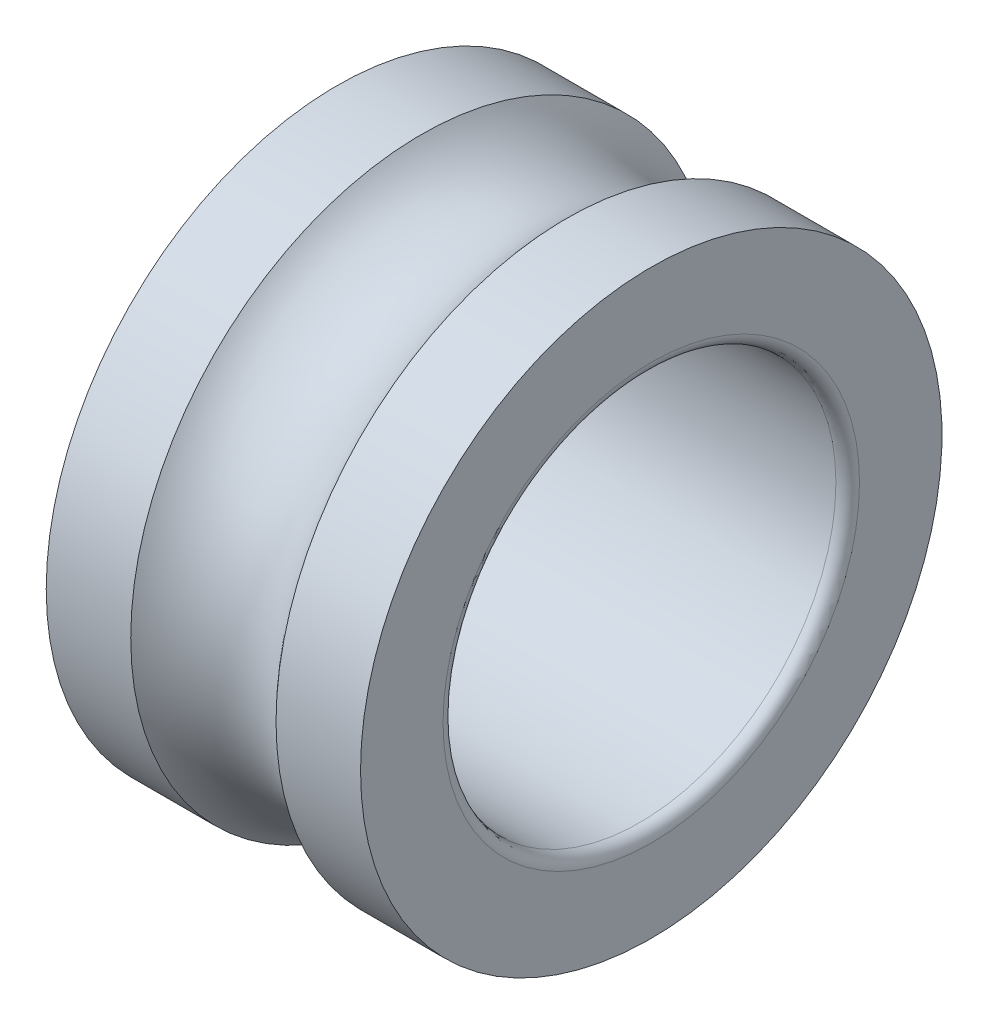
ISO-10303-21;
HEADER;
FILE_DESCRIPTION(('STEP AP214'),'2;1');
FILE_NAME('part.step','',(''),(''),'','','');
FILE_SCHEMA(('AUTOMOTIVE_DESIGN { 1 0 10303 214 1 1 1 1 }'));
ENDSEC;
DATA;
#1=APPLICATION_CONTEXT('core data for automotive mechanical design processes');
#2=APPLICATION_PROTOCOL_DEFINITION('international standard','automotive_design',2000,#1);
#3=PRODUCT_CONTEXT('',#1,'mechanical');
#4=PRODUCT('Part','Part','',(#3));
#5=PRODUCT_RELATED_PRODUCT_CATEGORY('part','',(#4));
#6=PRODUCT_DEFINITION_FORMATION('','',#4);
#7=PRODUCT_DEFINITION_CONTEXT('part definition',#1,'design');
#8=PRODUCT_DEFINITION('design','',#6,#7);
#9=PRODUCT_DEFINITION_SHAPE('','',#8);
#10=(LENGTH_UNIT() NAMED_UNIT(*) SI_UNIT(.MILLI.,.METRE.));
#11=(NAMED_UNIT(*) PLANE_ANGLE_UNIT() SI_UNIT($,.RADIAN.));
#12=(NAMED_UNIT(*) SI_UNIT($,.STERADIAN.) SOLID_ANGLE_UNIT());
#13=UNCERTAINTY_MEASURE_WITH_UNIT(LENGTH_MEASURE(1.E-05),#10,'distance_accuracy_value','');
#14=(GEOMETRIC_REPRESENTATION_CONTEXT(3) GLOBAL_UNCERTAINTY_ASSIGNED_CONTEXT((#13)) GLOBAL_UNIT_ASSIGNED_CONTEXT((#10,
#11,#12)) REPRESENTATION_CONTEXT('',''));
#15=CARTESIAN_POINT('',(0.,0.,0.));
#16=DIRECTION('',(0.,0.,1.));
#17=DIRECTION('',(1.,0.,0.));
#18=AXIS2_PLACEMENT_3D('',#15,#16,#17);
#19=CARTESIAN_POINT('',(4.,0.,0.));
#20=DIRECTION('',(1.,0.,0.));
#21=DIRECTION('',(0.,0.,-1.));
#22=AXIS2_PLACEMENT_3D('',#19,#20,#21);
#23=TOROIDAL_SURFACE('',#22,8.9,2.381);
#24=CARTESIAN_POINT('',(2.15090265264373,0.,0.));
#25=DIRECTION('',(-1.,0.,0.));
#26=DIRECTION('',(0.,0.,1.));
#27=AXIS2_PLACEMENT_3D('',#24,#25,#26);
#28=CIRCLE('',#27,7.4);
#29=CARTESIAN_POINT('',(2.15090265264373,0.,7.4));
#30=VERTEX_POINT('',#29);
#31=EDGE_CURVE('E109',#30,#30,#28,.T.);
#32=ORIENTED_EDGE('',*,*,#31,.F.);
#33=EDGE_LOOP('',(#32));
#34=FACE_BOUND('',#33,.T.);
#35=CARTESIAN_POINT('',(5.84909734735627,0.,0.));
#36=DIRECTION('',(-1.,0.,0.));
#37=DIRECTION('',(0.,0.,1.));
#38=AXIS2_PLACEMENT_3D('',#35,#36,#37);
#39=CIRCLE('',#38,7.4);
#40=CARTESIAN_POINT('',(5.84909734735627,0.,7.4));
#41=VERTEX_POINT('',#40);
#42=EDGE_CURVE('E114',#41,#41,#39,.F.);
#43=ORIENTED_EDGE('',*,*,#42,.F.);
#44=EDGE_LOOP('',(#43));
#45=FACE_BOUND('',#44,.T.);
#46=ADVANCED_FACE('F14',(#34,#45),#23,.F.);
#47=CARTESIAN_POINT('',(50.,0.,0.));
#48=DIRECTION('',(-1.,0.,0.));
#49=DIRECTION('',(0.,0.,1.));
#50=AXIS2_PLACEMENT_3D('',#47,#48,#49);
#51=CYLINDRICAL_SURFACE('',#50,7.4);
#52=CARTESIAN_POINT('',(8.,0.,0.));
#53=DIRECTION('',(-1.,0.,0.));
#54=DIRECTION('',(0.,0.,1.));
#55=AXIS2_PLACEMENT_3D('',#52,#53,#54);
#56=CIRCLE('',#55,7.4);
#57=CARTESIAN_POINT('',(8.,0.,7.4));
#58=VERTEX_POINT('',#57);
#59=EDGE_CURVE('E18',#58,#58,#56,.F.);
#60=ORIENTED_EDGE('',*,*,#59,.F.);
#61=EDGE_LOOP('',(#60));
#62=FACE_BOUND('',#61,.T.);
#63=ORIENTED_EDGE('',*,*,#42,.T.);
#64=EDGE_LOOP('',(#63));
#65=FACE_BOUND('',#64,.T.);
#66=ADVANCED_FACE('F84',(#62,#65),#51,.T.);
#67=CARTESIAN_POINT('',(50.,0.,0.));
#68=DIRECTION('',(-1.,0.,0.));
#69=DIRECTION('',(0.,0.,1.));
#70=AXIS2_PLACEMENT_3D('',#67,#68,#69);
#71=CYLINDRICAL_SURFACE('',#70,7.4);
#72=ORIENTED_EDGE('',*,*,#31,.T.);
#73=EDGE_LOOP('',(#72));
#74=FACE_BOUND('',#73,.T.);
#75=CARTESIAN_POINT('',(0.,0.,0.));
#76=DIRECTION('',(-1.,0.,0.));
#77=DIRECTION('',(0.,0.,1.));
#78=AXIS2_PLACEMENT_3D('',#75,#76,#77);
#79=CIRCLE('',#78,7.4);
#80=CARTESIAN_POINT('',(0.,0.,7.4));
#81=VERTEX_POINT('',#80);
#82=EDGE_CURVE('E104',#81,#81,#79,.T.);
#83=ORIENTED_EDGE('',*,*,#82,.F.);
#84=EDGE_LOOP('',(#83));
#85=FACE_BOUND('',#84,.T.);
#86=ADVANCED_FACE('F81',(#74,#85),#71,.T.);
#87=CARTESIAN_POINT('',(8.,5.3,0.));
#88=DIRECTION('',(1.,0.,0.));
#89=DIRECTION('',(0.,0.,-1.));
#90=AXIS2_PLACEMENT_3D('',#87,#88,#89);
#91=PLANE('',#90);
#92=CARTESIAN_POINT('',(8.,0.,0.));
#93=DIRECTION('',(1.,0.,0.));
#94=DIRECTION('',(0.,0.,-1.));
#95=AXIS2_PLACEMENT_3D('',#92,#93,#94);
#96=CIRCLE('',#95,5.3);
#97=CARTESIAN_POINT('',(8.,0.,-5.3));
#98=VERTEX_POINT('',#97);
#99=EDGE_CURVE('E65',#98,#98,#96,.T.);
#100=ORIENTED_EDGE('',*,*,#99,.F.);
#101=EDGE_LOOP('',(#100));
#102=FACE_BOUND('',#101,.T.);
#103=ORIENTED_EDGE('',*,*,#59,.T.);
#104=EDGE_LOOP('',(#103));
#105=FACE_BOUND('',#104,.T.);
#106=ADVANCED_FACE('F71',(#102,#105),#91,.T.);
#107=CARTESIAN_POINT('',(0.,7.4,0.));
#108=DIRECTION('',(-1.,0.,0.));
#109=DIRECTION('',(0.,0.,1.));
#110=AXIS2_PLACEMENT_3D('',#107,#108,#109);
#111=PLANE('',#110);
#112=ORIENTED_EDGE('',*,*,#82,.T.);
#113=EDGE_LOOP('',(#112));
#114=FACE_BOUND('',#113,.T.);
#115=CARTESIAN_POINT('',(0.,0.,0.));
#116=DIRECTION('',(-1.,0.,0.));
#117=DIRECTION('',(0.,0.,-1.));
#118=AXIS2_PLACEMENT_3D('',#115,#116,#117);
#119=CIRCLE('',#118,5.30000000447035);
#120=CARTESIAN_POINT('',(0.,0.,-5.30000000447035));
#121=VERTEX_POINT('',#120);
#122=EDGE_CURVE('E27',#121,#121,#119,.T.);
#123=ORIENTED_EDGE('',*,*,#122,.F.);
#124=EDGE_LOOP('',(#123));
#125=FACE_BOUND('',#124,.T.);
#126=ADVANCED_FACE('F80',(#114,#125),#111,.T.);
#127=CARTESIAN_POINT('',(7.7,0.,0.));
#128=DIRECTION('',(1.,0.,0.));
#129=DIRECTION('',(0.,0.,-1.));
#130=AXIS2_PLACEMENT_3D('',#127,#128,#129);
#131=TOROIDAL_SURFACE('',#130,5.3,0.300000000000003);
#132=CARTESIAN_POINT('',(7.7,0.,0.));
#133=DIRECTION('',(-1.,0.,0.));
#134=DIRECTION('',(0.,0.,1.));
#135=AXIS2_PLACEMENT_3D('',#132,#133,#134);
#136=CIRCLE('',#135,5.);
#137=CARTESIAN_POINT('',(7.7,0.,5.));
#138=VERTEX_POINT('',#137);
#139=EDGE_CURVE('E22',#138,#138,#136,.T.);
#140=ORIENTED_EDGE('',*,*,#139,.T.);
#141=EDGE_LOOP('',(#140));
#142=FACE_BOUND('',#141,.T.);
#143=ORIENTED_EDGE('',*,*,#99,.T.);
#144=EDGE_LOOP('',(#143));
#145=FACE_BOUND('',#144,.T.);
#146=ADVANCED_FACE('F45',(#142,#145),#131,.T.);
#147=CARTESIAN_POINT('',(0.300000000000001,0.,0.));
#148=DIRECTION('',(1.,0.,0.));
#149=DIRECTION('',(0.,0.,-1.));
#150=AXIS2_PLACEMENT_3D('',#147,#148,#149);
#151=TOROIDAL_SURFACE('',#150,5.3,0.300000000000001);
#152=ORIENTED_EDGE('',*,*,#122,.T.);
#153=EDGE_LOOP('',(#152));
#154=FACE_BOUND('',#153,.T.);
#155=CARTESIAN_POINT('',(0.300000000000002,0.,0.));
#156=DIRECTION('',(-1.,0.,0.));
#157=DIRECTION('',(0.,0.,1.));
#158=AXIS2_PLACEMENT_3D('',#155,#156,#157);
#159=CIRCLE('',#158,5.);
#160=CARTESIAN_POINT('',(0.300000000000002,0.,5.));
#161=VERTEX_POINT('',#160);
#162=EDGE_CURVE('E10',#161,#161,#159,.F.);
#163=ORIENTED_EDGE('',*,*,#162,.T.);
#164=EDGE_LOOP('',(#163));
#165=FACE_BOUND('',#164,.T.);
#166=ADVANCED_FACE('F39',(#154,#165),#151,.T.);
#167=CARTESIAN_POINT('',(50.,0.,0.));
#168=DIRECTION('',(-1.,0.,0.));
#169=DIRECTION('',(0.,0.,1.));
#170=AXIS2_PLACEMENT_3D('',#167,#168,#169);
#171=CYLINDRICAL_SURFACE('',#170,5.);
#172=ORIENTED_EDGE('',*,*,#162,.F.);
#173=EDGE_LOOP('',(#172));
#174=FACE_BOUND('',#173,.T.);
#175=ORIENTED_EDGE('',*,*,#139,.F.);
#176=EDGE_LOOP('',(#175));
#177=FACE_BOUND('',#176,.T.);
#178=ADVANCED_FACE('F44',(#174,#177),#171,.F.);
#179=CLOSED_SHELL('',(#46,#66,#86,#106,#126,#146,#166,#178));
#180=MANIFOLD_SOLID_BREP('B1',#179);
#181=ADVANCED_BREP_SHAPE_REPRESENTATION('',(#18,#180),#14);
#182=SHAPE_DEFINITION_REPRESENTATION(#9,#181);
ENDSEC;
END-ISO-10303-21;
